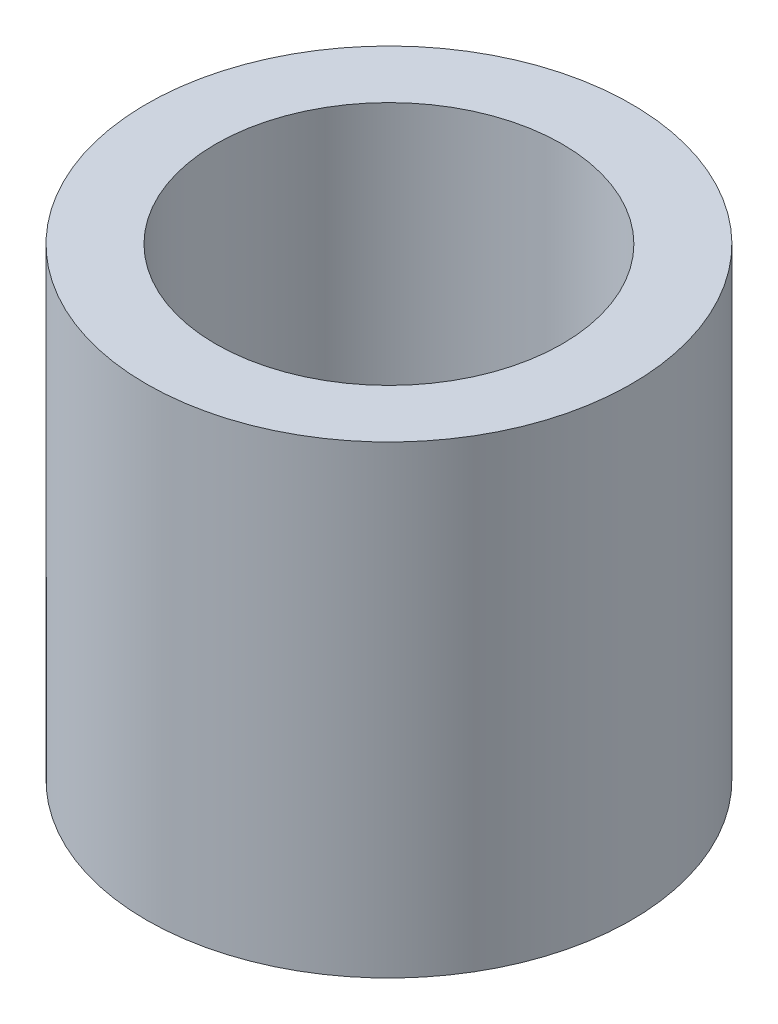
ISO-10303-21;
HEADER;
FILE_DESCRIPTION(('STEP AP214'),'2;1');
FILE_NAME('part.step','',(''),(''),'','','');
FILE_SCHEMA(('AUTOMOTIVE_DESIGN { 1 0 10303 214 1 1 1 1 }'));
ENDSEC;
DATA;
#1=APPLICATION_CONTEXT('core data for automotive mechanical design processes');
#2=APPLICATION_PROTOCOL_DEFINITION('international standard','automotive_design',2000,#1);
#3=PRODUCT_CONTEXT('',#1,'mechanical');
#4=PRODUCT('Part','Part','',(#3));
#5=PRODUCT_RELATED_PRODUCT_CATEGORY('part','',(#4));
#6=PRODUCT_DEFINITION_FORMATION('','',#4);
#7=PRODUCT_DEFINITION_CONTEXT('part definition',#1,'design');
#8=PRODUCT_DEFINITION('design','',#6,#7);
#9=PRODUCT_DEFINITION_SHAPE('','',#8);
#10=(LENGTH_UNIT() NAMED_UNIT(*) SI_UNIT(.MILLI.,.METRE.));
#11=(NAMED_UNIT(*) PLANE_ANGLE_UNIT() SI_UNIT($,.RADIAN.));
#12=(NAMED_UNIT(*) SI_UNIT($,.STERADIAN.) SOLID_ANGLE_UNIT());
#13=UNCERTAINTY_MEASURE_WITH_UNIT(LENGTH_MEASURE(1.E-05),#10,'distance_accuracy_value','');
#14=(GEOMETRIC_REPRESENTATION_CONTEXT(3) GLOBAL_UNCERTAINTY_ASSIGNED_CONTEXT((#13)) GLOBAL_UNIT_ASSIGNED_CONTEXT((#10,
#11,#12)) REPRESENTATION_CONTEXT('',''));
#15=CARTESIAN_POINT('',(0.,0.,0.));
#16=DIRECTION('',(0.,0.,1.));
#17=DIRECTION('',(1.,0.,0.));
#18=AXIS2_PLACEMENT_3D('',#15,#16,#17);
#19=CARTESIAN_POINT('',(0.,6.7,0.));
#20=DIRECTION('',(0.,1.,0.));
#21=DIRECTION('',(0.,0.,1.));
#22=AXIS2_PLACEMENT_3D('',#19,#20,#21);
#23=PLANE('',#22);
#24=CARTESIAN_POINT('',(0.,6.7,0.));
#25=DIRECTION('',(0.,1.,0.));
#26=DIRECTION('',(0.,0.,1.));
#27=AXIS2_PLACEMENT_3D('',#24,#25,#26);
#28=CIRCLE('',#27,3.5);
#29=CARTESIAN_POINT('',(0.,6.7,3.5));
#30=VERTEX_POINT('',#29);
#31=EDGE_CURVE('E10',#30,#30,#28,.T.);
#32=ORIENTED_EDGE('',*,*,#31,.T.);
#33=EDGE_LOOP('',(#32));
#34=FACE_BOUND('',#33,.T.);
#35=CARTESIAN_POINT('',(0.,6.7,0.));
#36=DIRECTION('',(0.,1.,0.));
#37=DIRECTION('',(0.,0.,1.));
#38=AXIS2_PLACEMENT_3D('',#35,#36,#37);
#39=CIRCLE('',#38,2.5);
#40=CARTESIAN_POINT('',(0.,6.7,2.5));
#41=VERTEX_POINT('',#40);
#42=EDGE_CURVE('E52',#41,#41,#39,.T.);
#43=ORIENTED_EDGE('',*,*,#42,.F.);
#44=EDGE_LOOP('',(#43));
#45=FACE_BOUND('',#44,.T.);
#46=ADVANCED_FACE('F41',(#34,#45),#23,.T.);
#47=CARTESIAN_POINT('',(0.,0.,0.));
#48=DIRECTION('',(0.,1.,0.));
#49=DIRECTION('',(0.,0.,1.));
#50=AXIS2_PLACEMENT_3D('',#47,#48,#49);
#51=PLANE('',#50);
#52=CARTESIAN_POINT('',(0.,0.,0.));
#53=DIRECTION('',(0.,1.,0.));
#54=DIRECTION('',(0.,0.,1.));
#55=AXIS2_PLACEMENT_3D('',#52,#53,#54);
#56=CIRCLE('',#55,3.5);
#57=CARTESIAN_POINT('',(0.,0.,3.5));
#58=VERTEX_POINT('',#57);
#59=EDGE_CURVE('E45',#58,#58,#56,.T.);
#60=ORIENTED_EDGE('',*,*,#59,.F.);
#61=EDGE_LOOP('',(#60));
#62=FACE_BOUND('',#61,.T.);
#63=CARTESIAN_POINT('',(0.,0.,0.));
#64=DIRECTION('',(0.,1.,0.));
#65=DIRECTION('',(0.,0.,1.));
#66=AXIS2_PLACEMENT_3D('',#63,#64,#65);
#67=CIRCLE('',#66,2.5);
#68=CARTESIAN_POINT('',(0.,0.,2.5));
#69=VERTEX_POINT('',#68);
#70=EDGE_CURVE('E54',#69,#69,#67,.T.);
#71=ORIENTED_EDGE('',*,*,#70,.T.);
#72=EDGE_LOOP('',(#71));
#73=FACE_BOUND('',#72,.T.);
#74=ADVANCED_FACE('F64',(#62,#73),#51,.F.);
#75=CARTESIAN_POINT('',(0.,6.7,0.));
#76=DIRECTION('',(0.,-1.,0.));
#77=DIRECTION('',(0.,0.,-1.));
#78=AXIS2_PLACEMENT_3D('',#75,#76,#77);
#79=CYLINDRICAL_SURFACE('',#78,3.5);
#80=ORIENTED_EDGE('',*,*,#31,.F.);
#81=EDGE_LOOP('',(#80));
#82=FACE_BOUND('',#81,.T.);
#83=ORIENTED_EDGE('',*,*,#59,.T.);
#84=EDGE_LOOP('',(#83));
#85=FACE_BOUND('',#84,.T.);
#86=ADVANCED_FACE('F43',(#82,#85),#79,.T.);
#87=CARTESIAN_POINT('',(0.,6.7,0.));
#88=DIRECTION('',(0.,-1.,0.));
#89=DIRECTION('',(0.,0.,-1.));
#90=AXIS2_PLACEMENT_3D('',#87,#88,#89);
#91=CYLINDRICAL_SURFACE('',#90,2.5);
#92=ORIENTED_EDGE('',*,*,#42,.T.);
#93=EDGE_LOOP('',(#92));
#94=FACE_BOUND('',#93,.T.);
#95=ORIENTED_EDGE('',*,*,#70,.F.);
#96=EDGE_LOOP('',(#95));
#97=FACE_BOUND('',#96,.T.);
#98=ADVANCED_FACE('F60',(#94,#97),#91,.F.);
#99=CLOSED_SHELL('',(#46,#74,#86,#98));
#100=MANIFOLD_SOLID_BREP('B2',#99);
#101=ADVANCED_BREP_SHAPE_REPRESENTATION('',(#18,#100),#14);
#102=SHAPE_DEFINITION_REPRESENTATION(#9,#101);
ENDSEC;
END-ISO-10303-21;
